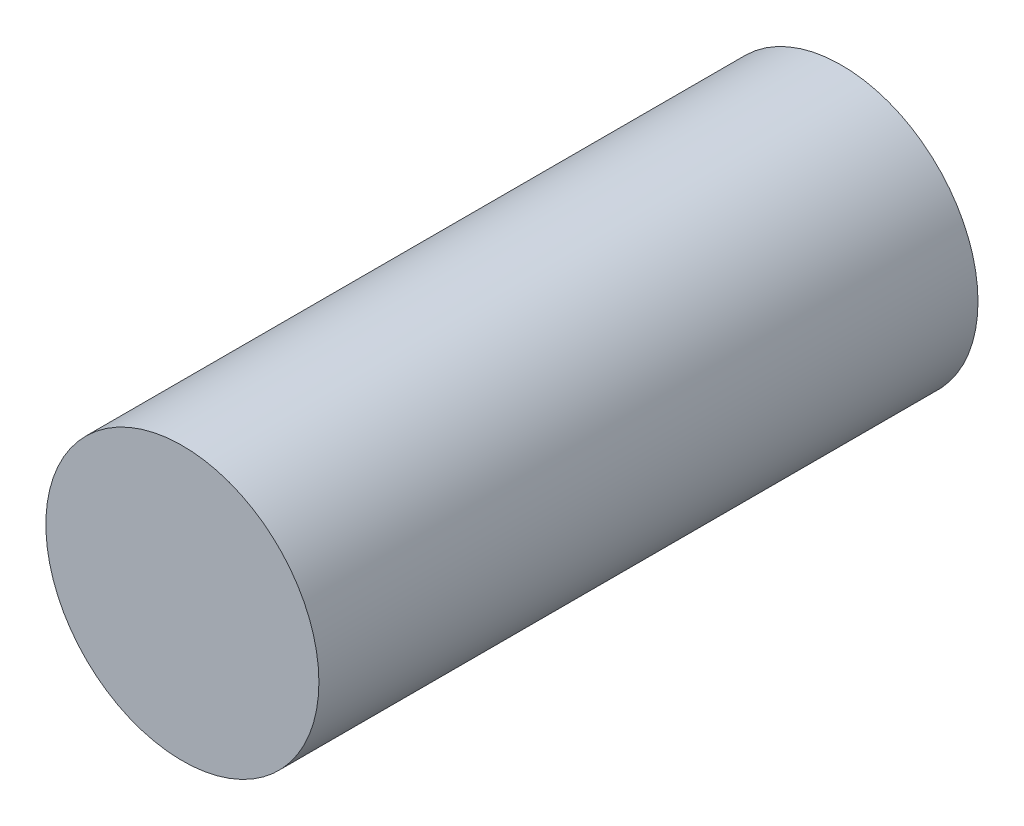
ISO-10303-21;
HEADER;
FILE_DESCRIPTION(('STEP AP214'),'2;1');
FILE_NAME('part.step','',(''),(''),'','','');
FILE_SCHEMA(('AUTOMOTIVE_DESIGN { 1 0 10303 214 1 1 1 1 }'));
ENDSEC;
DATA;
#1=APPLICATION_CONTEXT('core data for automotive mechanical design processes');
#2=APPLICATION_PROTOCOL_DEFINITION('international standard','automotive_design',2000,#1);
#3=PRODUCT_CONTEXT('',#1,'mechanical');
#4=PRODUCT('Part','Part','',(#3));
#5=PRODUCT_RELATED_PRODUCT_CATEGORY('part','',(#4));
#6=PRODUCT_DEFINITION_FORMATION('','',#4);
#7=PRODUCT_DEFINITION_CONTEXT('part definition',#1,'design');
#8=PRODUCT_DEFINITION('design','',#6,#7);
#9=PRODUCT_DEFINITION_SHAPE('','',#8);
#10=(LENGTH_UNIT() NAMED_UNIT(*) SI_UNIT(.MILLI.,.METRE.));
#11=(NAMED_UNIT(*) PLANE_ANGLE_UNIT() SI_UNIT($,.RADIAN.));
#12=(NAMED_UNIT(*) SI_UNIT($,.STERADIAN.) SOLID_ANGLE_UNIT());
#13=UNCERTAINTY_MEASURE_WITH_UNIT(LENGTH_MEASURE(1.E-05),#10,'distance_accuracy_value','');
#14=(GEOMETRIC_REPRESENTATION_CONTEXT(3) GLOBAL_UNCERTAINTY_ASSIGNED_CONTEXT((#13)) GLOBAL_UNIT_ASSIGNED_CONTEXT((#10,
#11,#12)) REPRESENTATION_CONTEXT('',''));
#15=CARTESIAN_POINT('',(0.,0.,0.));
#16=DIRECTION('',(0.,0.,1.));
#17=DIRECTION('',(1.,0.,0.));
#18=AXIS2_PLACEMENT_3D('',#15,#16,#17);
#19=CARTESIAN_POINT('',(0.,0.,177.8));
#20=DIRECTION('',(0.,0.,-1.));
#21=DIRECTION('',(-1.,0.,0.));
#22=AXIS2_PLACEMENT_3D('',#19,#20,#21);
#23=CYLINDRICAL_SURFACE('',#22,36.83);
#24=CARTESIAN_POINT('',(0.,0.,177.8));
#25=DIRECTION('',(0.,0.,1.));
#26=DIRECTION('',(1.,0.,0.));
#27=AXIS2_PLACEMENT_3D('',#24,#25,#26);
#28=CIRCLE('',#27,36.83);
#29=CARTESIAN_POINT('',(36.83,0.,177.8));
#30=VERTEX_POINT('',#29);
#31=EDGE_CURVE('E10',#30,#30,#28,.T.);
#32=ORIENTED_EDGE('',*,*,#31,.F.);
#33=EDGE_LOOP('',(#32));
#34=FACE_BOUND('',#33,.T.);
#35=CARTESIAN_POINT('',(0.,0.,0.));
#36=DIRECTION('',(0.,0.,1.));
#37=DIRECTION('',(1.,0.,0.));
#38=AXIS2_PLACEMENT_3D('',#35,#36,#37);
#39=CIRCLE('',#38,36.83);
#40=CARTESIAN_POINT('',(36.83,0.,0.));
#41=VERTEX_POINT('',#40);
#42=EDGE_CURVE('E41',#41,#41,#39,.T.);
#43=ORIENTED_EDGE('',*,*,#42,.T.);
#44=EDGE_LOOP('',(#43));
#45=FACE_BOUND('',#44,.T.);
#46=ADVANCED_FACE('F38',(#34,#45),#23,.T.);
#47=CARTESIAN_POINT('',(0.,0.,177.8));
#48=DIRECTION('',(0.,0.,1.));
#49=DIRECTION('',(1.,0.,0.));
#50=AXIS2_PLACEMENT_3D('',#47,#48,#49);
#51=PLANE('',#50);
#52=ORIENTED_EDGE('',*,*,#31,.T.);
#53=EDGE_LOOP('',(#52));
#54=FACE_BOUND('',#53,.T.);
#55=ADVANCED_FACE('F53',(#54),#51,.T.);
#56=CARTESIAN_POINT('',(0.,0.,0.));
#57=DIRECTION('',(0.,0.,1.));
#58=DIRECTION('',(1.,0.,0.));
#59=AXIS2_PLACEMENT_3D('',#56,#57,#58);
#60=PLANE('',#59);
#61=ORIENTED_EDGE('',*,*,#42,.F.);
#62=EDGE_LOOP('',(#61));
#63=FACE_BOUND('',#62,.T.);
#64=ADVANCED_FACE('F51',(#63),#60,.F.);
#65=CLOSED_SHELL('',(#46,#55,#64));
#66=MANIFOLD_SOLID_BREP('B2',#65);
#67=ADVANCED_BREP_SHAPE_REPRESENTATION('',(#18,#66),#14);
#68=SHAPE_DEFINITION_REPRESENTATION(#9,#67);
ENDSEC;
END-ISO-10303-21;
